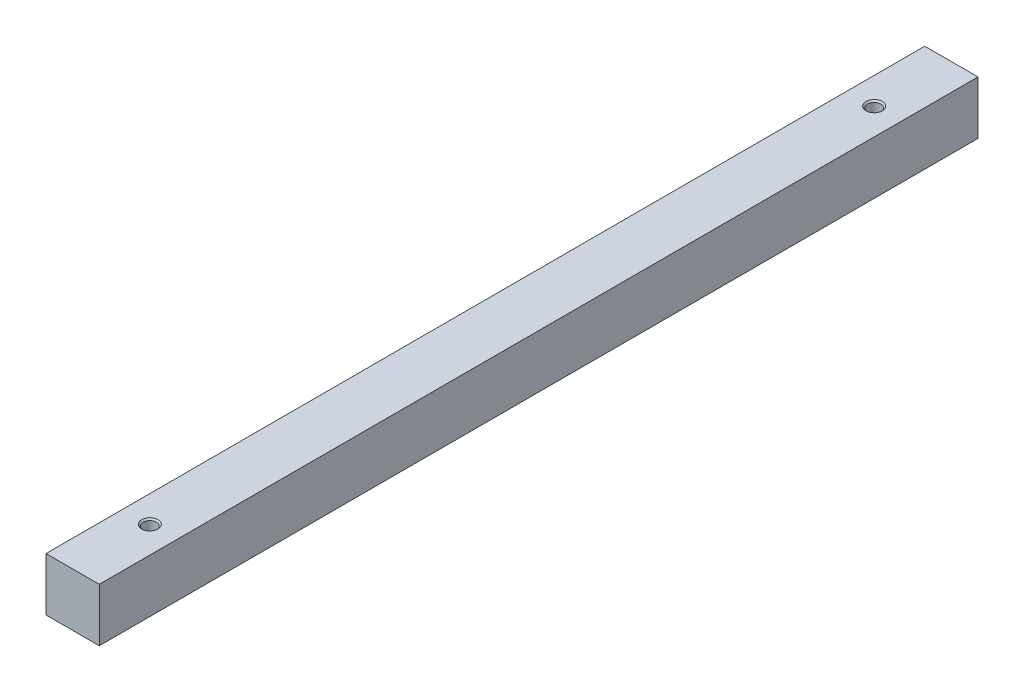
ISO-10303-21;
HEADER;
FILE_DESCRIPTION(('STEP AP214'),'2;1');
FILE_NAME('part.step','',(''),(''),'','','');
FILE_SCHEMA(('AUTOMOTIVE_DESIGN { 1 0 10303 214 1 1 1 1 }'));
ENDSEC;
DATA;
#1=APPLICATION_CONTEXT('core data for automotive mechanical design processes');
#2=APPLICATION_PROTOCOL_DEFINITION('international standard','automotive_design',2000,#1);
#3=PRODUCT_CONTEXT('',#1,'mechanical');
#4=PRODUCT('Part','Part','',(#3));
#5=PRODUCT_RELATED_PRODUCT_CATEGORY('part','',(#4));
#6=PRODUCT_DEFINITION_FORMATION('','',#4);
#7=PRODUCT_DEFINITION_CONTEXT('part definition',#1,'design');
#8=PRODUCT_DEFINITION('design','',#6,#7);
#9=PRODUCT_DEFINITION_SHAPE('','',#8);
#10=(LENGTH_UNIT() NAMED_UNIT(*) SI_UNIT(.MILLI.,.METRE.));
#11=(NAMED_UNIT(*) PLANE_ANGLE_UNIT() SI_UNIT($,.RADIAN.));
#12=(NAMED_UNIT(*) SI_UNIT($,.STERADIAN.) SOLID_ANGLE_UNIT());
#13=UNCERTAINTY_MEASURE_WITH_UNIT(LENGTH_MEASURE(1.E-05),#10,'distance_accuracy_value','');
#14=(GEOMETRIC_REPRESENTATION_CONTEXT(3) GLOBAL_UNCERTAINTY_ASSIGNED_CONTEXT((#13)) GLOBAL_UNIT_ASSIGNED_CONTEXT((#10,
#11,#12)) REPRESENTATION_CONTEXT('',''));
#15=CARTESIAN_POINT('',(0.,0.,0.));
#16=DIRECTION('',(0.,0.,1.));
#17=DIRECTION('',(1.,0.,0.));
#18=AXIS2_PLACEMENT_3D('',#15,#16,#17);
#19=CARTESIAN_POINT('',(-5.,5.,82.5));
#20=DIRECTION('',(1.,0.,0.));
#21=DIRECTION('',(0.,1.,0.));
#22=AXIS2_PLACEMENT_3D('',#19,#20,#21);
#23=PLANE('',#22);
#24=DIRECTION('',(0.,-1.,0.));
#25=VECTOR('',#24,1.);
#26=CARTESIAN_POINT('',(-5.,5.,-82.5));
#27=LINE('',#26,#25);
#28=CARTESIAN_POINT('',(-5.,5.,-82.5));
#29=VERTEX_POINT('',#28);
#30=CARTESIAN_POINT('',(-5.,-5.,-82.5));
#31=VERTEX_POINT('',#30);
#32=EDGE_CURVE('E98',#29,#31,#27,.T.);
#33=ORIENTED_EDGE('',*,*,#32,.T.);
#34=DIRECTION('',(0.,0.,-1.));
#35=VECTOR('',#34,1.);
#36=CARTESIAN_POINT('',(-5.,-5.,82.5));
#37=LINE('',#36,#35);
#38=CARTESIAN_POINT('',(-5.,-5.,82.5));
#39=VERTEX_POINT('',#38);
#40=EDGE_CURVE('E11',#39,#31,#37,.T.);
#41=ORIENTED_EDGE('',*,*,#40,.F.);
#42=DIRECTION('',(0.,-1.,0.));
#43=VECTOR('',#42,1.);
#44=CARTESIAN_POINT('',(-5.,5.,82.5));
#45=LINE('',#44,#43);
#46=CARTESIAN_POINT('',(-5.,5.,82.5));
#47=VERTEX_POINT('',#46);
#48=EDGE_CURVE('E86',#47,#39,#45,.T.);
#49=ORIENTED_EDGE('',*,*,#48,.F.);
#50=DIRECTION('',(0.,0.,-1.));
#51=VECTOR('',#50,1.);
#52=CARTESIAN_POINT('',(-5.,5.,82.5));
#53=LINE('',#52,#51);
#54=EDGE_CURVE('E94',#47,#29,#53,.T.);
#55=ORIENTED_EDGE('',*,*,#54,.T.);
#56=EDGE_LOOP('',(#33,#41,#49,#55));
#57=FACE_BOUND('',#56,.T.);
#58=ADVANCED_FACE('F35',(#57),#23,.F.);
#59=CARTESIAN_POINT('',(-5.,-5.,82.5));
#60=DIRECTION('',(0.,1.,0.));
#61=DIRECTION('',(0.,0.,1.));
#62=AXIS2_PLACEMENT_3D('',#59,#60,#61);
#63=PLANE('',#62);
#64=CARTESIAN_POINT('',(0.,-5.,-68.));
#65=DIRECTION('',(0.,1.,0.));
#66=DIRECTION('',(0.,0.,1.));
#67=AXIS2_PLACEMENT_3D('',#64,#65,#66);
#68=CIRCLE('',#67,1.25);
#69=CARTESIAN_POINT('',(0.,-5.,-66.75));
#70=VERTEX_POINT('',#69);
#71=EDGE_CURVE('E120',#70,#70,#68,.T.);
#72=ORIENTED_EDGE('',*,*,#71,.T.);
#73=EDGE_LOOP('',(#72));
#74=FACE_BOUND('',#73,.T.);
#75=CARTESIAN_POINT('',(0.,-5.,68.));
#76=DIRECTION('',(0.,1.,0.));
#77=DIRECTION('',(0.,0.,1.));
#78=AXIS2_PLACEMENT_3D('',#75,#76,#77);
#79=CIRCLE('',#78,1.25);
#80=CARTESIAN_POINT('',(0.,-5.,69.25));
#81=VERTEX_POINT('',#80);
#82=EDGE_CURVE('E101',#81,#81,#79,.T.);
#83=ORIENTED_EDGE('',*,*,#82,.T.);
#84=EDGE_LOOP('',(#83));
#85=FACE_BOUND('',#84,.T.);
#86=DIRECTION('',(1.,0.,0.));
#87=VECTOR('',#86,1.);
#88=CARTESIAN_POINT('',(-5.,-5.,-82.5));
#89=LINE('',#88,#87);
#90=CARTESIAN_POINT('',(5.,-5.,-82.5));
#91=VERTEX_POINT('',#90);
#92=EDGE_CURVE('E90',#31,#91,#89,.T.);
#93=ORIENTED_EDGE('',*,*,#92,.T.);
#94=DIRECTION('',(0.,0.,-1.));
#95=VECTOR('',#94,1.);
#96=CARTESIAN_POINT('',(5.,-5.,82.5));
#97=LINE('',#96,#95);
#98=CARTESIAN_POINT('',(5.,-5.,82.5));
#99=VERTEX_POINT('',#98);
#100=EDGE_CURVE('E43',#99,#91,#97,.T.);
#101=ORIENTED_EDGE('',*,*,#100,.F.);
#102=DIRECTION('',(1.,0.,0.));
#103=VECTOR('',#102,1.);
#104=CARTESIAN_POINT('',(-5.,-5.,82.5));
#105=LINE('',#104,#103);
#106=EDGE_CURVE('E81',#39,#99,#105,.T.);
#107=ORIENTED_EDGE('',*,*,#106,.F.);
#108=ORIENTED_EDGE('',*,*,#40,.T.);
#109=EDGE_LOOP('',(#93,#101,#107,#108));
#110=FACE_BOUND('',#109,.T.);
#111=ADVANCED_FACE('F89',(#74,#85,#110),#63,.F.);
#112=CARTESIAN_POINT('',(5.,5.,82.5));
#113=DIRECTION('',(-1.,0.,0.));
#114=DIRECTION('',(0.,-1.,0.));
#115=AXIS2_PLACEMENT_3D('',#112,#113,#114);
#116=PLANE('',#115);
#117=DIRECTION('',(0.,1.,0.));
#118=VECTOR('',#117,1.);
#119=CARTESIAN_POINT('',(5.,5.,-82.5));
#120=LINE('',#119,#118);
#121=CARTESIAN_POINT('',(5.,5.,-82.5));
#122=VERTEX_POINT('',#121);
#123=EDGE_CURVE('E68',#91,#122,#120,.T.);
#124=ORIENTED_EDGE('',*,*,#123,.T.);
#125=DIRECTION('',(0.,0.,-1.));
#126=VECTOR('',#125,1.);
#127=CARTESIAN_POINT('',(5.,5.,82.5));
#128=LINE('',#127,#126);
#129=CARTESIAN_POINT('',(5.,5.,82.5));
#130=VERTEX_POINT('',#129);
#131=EDGE_CURVE('E91',#130,#122,#128,.T.);
#132=ORIENTED_EDGE('',*,*,#131,.F.);
#133=DIRECTION('',(0.,1.,0.));
#134=VECTOR('',#133,1.);
#135=CARTESIAN_POINT('',(5.,5.,82.5));
#136=LINE('',#135,#134);
#137=EDGE_CURVE('E84',#99,#130,#136,.T.);
#138=ORIENTED_EDGE('',*,*,#137,.F.);
#139=ORIENTED_EDGE('',*,*,#100,.T.);
#140=EDGE_LOOP('',(#124,#132,#138,#139));
#141=FACE_BOUND('',#140,.T.);
#142=ADVANCED_FACE('F92',(#141),#116,.F.);
#143=CARTESIAN_POINT('',(-5.,5.,82.5));
#144=DIRECTION('',(0.,-1.,0.));
#145=DIRECTION('',(0.,0.,-1.));
#146=AXIS2_PLACEMENT_3D('',#143,#144,#145);
#147=PLANE('',#146);
#148=CARTESIAN_POINT('',(0.,5.,-68.));
#149=DIRECTION('',(0.,1.,0.));
#150=DIRECTION('',(0.,0.,1.));
#151=AXIS2_PLACEMENT_3D('',#148,#149,#150);
#152=CIRCLE('',#151,1.525);
#153=CARTESIAN_POINT('',(0.,5.,-66.475));
#154=VERTEX_POINT('',#153);
#155=EDGE_CURVE('E126',#154,#154,#152,.T.);
#156=ORIENTED_EDGE('',*,*,#155,.F.);
#157=EDGE_LOOP('',(#156));
#158=FACE_BOUND('',#157,.T.);
#159=CARTESIAN_POINT('',(0.,5.,68.));
#160=DIRECTION('',(0.,1.,0.));
#161=DIRECTION('',(0.,0.,1.));
#162=AXIS2_PLACEMENT_3D('',#159,#160,#161);
#163=CIRCLE('',#162,1.525);
#164=CARTESIAN_POINT('',(0.,5.,69.525));
#165=VERTEX_POINT('',#164);
#166=EDGE_CURVE('E117',#165,#165,#163,.T.);
#167=ORIENTED_EDGE('',*,*,#166,.F.);
#168=EDGE_LOOP('',(#167));
#169=FACE_BOUND('',#168,.T.);
#170=DIRECTION('',(-1.,0.,0.));
#171=VECTOR('',#170,1.);
#172=CARTESIAN_POINT('',(-5.,5.,-82.5));
#173=LINE('',#172,#171);
#174=EDGE_CURVE('E74',#122,#29,#173,.T.);
#175=ORIENTED_EDGE('',*,*,#174,.T.);
#176=ORIENTED_EDGE('',*,*,#54,.F.);
#177=DIRECTION('',(-1.,0.,0.));
#178=VECTOR('',#177,1.);
#179=CARTESIAN_POINT('',(-5.,5.,82.5));
#180=LINE('',#179,#178);
#181=EDGE_CURVE('E51',#130,#47,#180,.T.);
#182=ORIENTED_EDGE('',*,*,#181,.F.);
#183=ORIENTED_EDGE('',*,*,#131,.T.);
#184=EDGE_LOOP('',(#175,#176,#182,#183));
#185=FACE_BOUND('',#184,.T.);
#186=ADVANCED_FACE('F106',(#158,#169,#185),#147,.F.);
#187=CARTESIAN_POINT('',(0.,0.,82.5));
#188=DIRECTION('',(0.,0.,1.));
#189=DIRECTION('',(1.,0.,0.));
#190=AXIS2_PLACEMENT_3D('',#187,#188,#189);
#191=PLANE('',#190);
#192=ORIENTED_EDGE('',*,*,#48,.T.);
#193=ORIENTED_EDGE('',*,*,#106,.T.);
#194=ORIENTED_EDGE('',*,*,#137,.T.);
#195=ORIENTED_EDGE('',*,*,#181,.T.);
#196=EDGE_LOOP('',(#192,#193,#194,#195));
#197=FACE_BOUND('',#196,.T.);
#198=ADVANCED_FACE('F82',(#197),#191,.T.);
#199=CARTESIAN_POINT('',(0.,0.,-82.5));
#200=DIRECTION('',(0.,0.,1.));
#201=DIRECTION('',(1.,0.,0.));
#202=AXIS2_PLACEMENT_3D('',#199,#200,#201);
#203=PLANE('',#202);
#204=ORIENTED_EDGE('',*,*,#32,.F.);
#205=ORIENTED_EDGE('',*,*,#174,.F.);
#206=ORIENTED_EDGE('',*,*,#123,.F.);
#207=ORIENTED_EDGE('',*,*,#92,.F.);
#208=EDGE_LOOP('',(#204,#205,#206,#207));
#209=FACE_BOUND('',#208,.T.);
#210=ADVANCED_FACE('F109',(#209),#203,.F.);
#211=CARTESIAN_POINT('',(0.,5.,68.));
#212=DIRECTION('',(0.,1.,0.));
#213=DIRECTION('',(0.,0.,1.));
#214=AXIS2_PLACEMENT_3D('',#211,#212,#213);
#215=CYLINDRICAL_SURFACE('',#214,1.25);
#216=ORIENTED_EDGE('',*,*,#82,.F.);
#217=EDGE_LOOP('',(#216));
#218=FACE_BOUND('',#217,.T.);
#219=CARTESIAN_POINT('',(0.,4.725,68.));
#220=DIRECTION('',(0.,1.,0.));
#221=DIRECTION('',(0.,0.,1.));
#222=AXIS2_PLACEMENT_3D('',#219,#220,#221);
#223=CIRCLE('',#222,1.25);
#224=CARTESIAN_POINT('',(0.,4.725,69.25));
#225=VERTEX_POINT('',#224);
#226=EDGE_CURVE('E114',#225,#225,#223,.T.);
#227=ORIENTED_EDGE('',*,*,#226,.T.);
#228=EDGE_LOOP('',(#227));
#229=FACE_BOUND('',#228,.T.);
#230=ADVANCED_FACE('F140',(#218,#229),#215,.F.);
#231=CARTESIAN_POINT('',(0.,5.,68.));
#232=DIRECTION('',(0.,1.,0.));
#233=DIRECTION('',(0.,0.,1.));
#234=AXIS2_PLACEMENT_3D('',#231,#232,#233);
#235=CONICAL_SURFACE('',#234,1.525,0.785398163397449);
#236=ORIENTED_EDGE('',*,*,#226,.F.);
#237=EDGE_LOOP('',(#236));
#238=FACE_BOUND('',#237,.T.);
#239=ORIENTED_EDGE('',*,*,#166,.T.);
#240=EDGE_LOOP('',(#239));
#241=FACE_BOUND('',#240,.T.);
#242=ADVANCED_FACE('F137',(#238,#241),#235,.F.);
#243=CARTESIAN_POINT('',(0.,5.,-68.));
#244=DIRECTION('',(0.,1.,0.));
#245=DIRECTION('',(0.,0.,1.));
#246=AXIS2_PLACEMENT_3D('',#243,#244,#245);
#247=CYLINDRICAL_SURFACE('',#246,1.25);
#248=ORIENTED_EDGE('',*,*,#71,.F.);
#249=EDGE_LOOP('',(#248));
#250=FACE_BOUND('',#249,.T.);
#251=CARTESIAN_POINT('',(0.,4.725,-68.));
#252=DIRECTION('',(0.,1.,0.));
#253=DIRECTION('',(0.,0.,1.));
#254=AXIS2_PLACEMENT_3D('',#251,#252,#253);
#255=CIRCLE('',#254,1.25);
#256=CARTESIAN_POINT('',(0.,4.725,-66.75));
#257=VERTEX_POINT('',#256);
#258=EDGE_CURVE('E123',#257,#257,#255,.T.);
#259=ORIENTED_EDGE('',*,*,#258,.T.);
#260=EDGE_LOOP('',(#259));
#261=FACE_BOUND('',#260,.T.);
#262=ADVANCED_FACE('F139',(#250,#261),#247,.F.);
#263=CARTESIAN_POINT('',(0.,5.,-68.));
#264=DIRECTION('',(0.,1.,0.));
#265=DIRECTION('',(0.,0.,1.));
#266=AXIS2_PLACEMENT_3D('',#263,#264,#265);
#267=CONICAL_SURFACE('',#266,1.525,0.785398163397449);
#268=ORIENTED_EDGE('',*,*,#258,.F.);
#269=EDGE_LOOP('',(#268));
#270=FACE_BOUND('',#269,.T.);
#271=ORIENTED_EDGE('',*,*,#155,.T.);
#272=EDGE_LOOP('',(#271));
#273=FACE_BOUND('',#272,.T.);
#274=ADVANCED_FACE('F130',(#270,#273),#267,.F.);
#275=CLOSED_SHELL('',(#58,#111,#142,#186,#198,#210,#230,#242,#262,#274));
#276=MANIFOLD_SOLID_BREP('B2',#275);
#277=ADVANCED_BREP_SHAPE_REPRESENTATION('',(#18,#276),#14);
#278=SHAPE_DEFINITION_REPRESENTATION(#9,#277);
ENDSEC;
END-ISO-10303-21;
